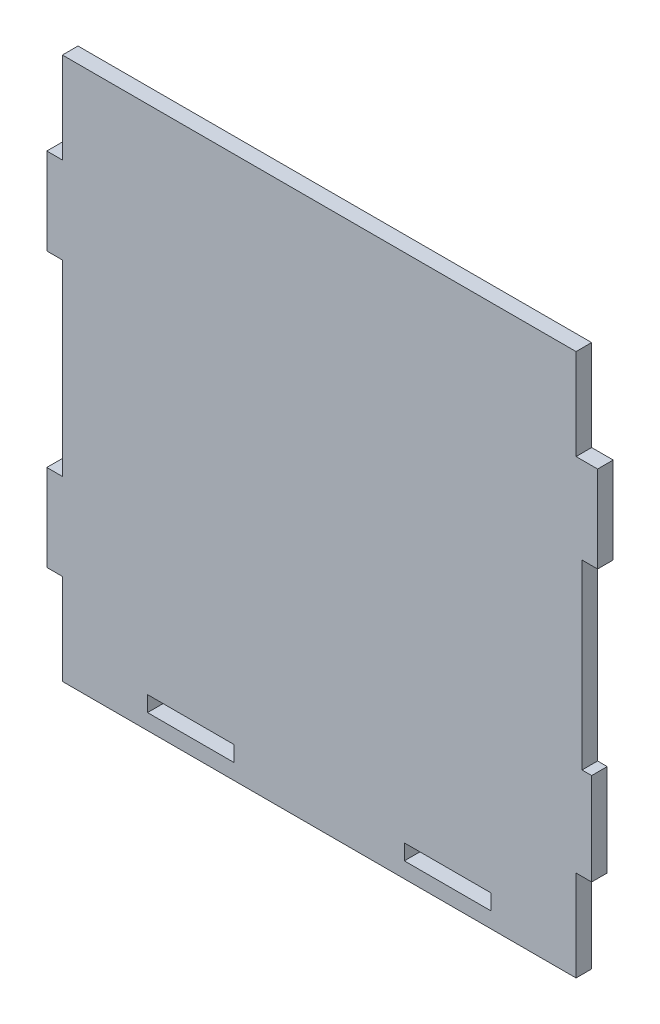
ISO-10303-21;
HEADER;
FILE_DESCRIPTION(('STEP AP214'),'2;1');
FILE_NAME('part.step','',(''),(''),'','','');
FILE_SCHEMA(('AUTOMOTIVE_DESIGN { 1 0 10303 214 1 1 1 1 }'));
ENDSEC;
DATA;
#1=APPLICATION_CONTEXT('core data for automotive mechanical design processes');
#2=APPLICATION_PROTOCOL_DEFINITION('international standard','automotive_design',2000,#1);
#3=PRODUCT_CONTEXT('',#1,'mechanical');
#4=PRODUCT('Part','Part','',(#3));
#5=PRODUCT_RELATED_PRODUCT_CATEGORY('part','',(#4));
#6=PRODUCT_DEFINITION_FORMATION('','',#4);
#7=PRODUCT_DEFINITION_CONTEXT('part definition',#1,'design');
#8=PRODUCT_DEFINITION('design','',#6,#7);
#9=PRODUCT_DEFINITION_SHAPE('','',#8);
#10=(LENGTH_UNIT() NAMED_UNIT(*) SI_UNIT(.MILLI.,.METRE.));
#11=(NAMED_UNIT(*) PLANE_ANGLE_UNIT() SI_UNIT($,.RADIAN.));
#12=(NAMED_UNIT(*) SI_UNIT($,.STERADIAN.) SOLID_ANGLE_UNIT());
#13=UNCERTAINTY_MEASURE_WITH_UNIT(LENGTH_MEASURE(1.E-05),#10,'distance_accuracy_value','');
#14=(GEOMETRIC_REPRESENTATION_CONTEXT(3) GLOBAL_UNCERTAINTY_ASSIGNED_CONTEXT((#13)) GLOBAL_UNIT_ASSIGNED_CONTEXT((#10,
#11,#12)) REPRESENTATION_CONTEXT('',''));
#15=CARTESIAN_POINT('',(0.,0.,0.));
#16=DIRECTION('',(0.,0.,1.));
#17=DIRECTION('',(1.,0.,0.));
#18=AXIS2_PLACEMENT_3D('',#15,#16,#17);
#19=CARTESIAN_POINT('',(0.,0.,18.));
#20=DIRECTION('',(0.,0.,1.));
#21=DIRECTION('',(1.,0.,0.));
#22=AXIS2_PLACEMENT_3D('',#19,#20,#21);
#23=PLANE('',#22);
#24=DIRECTION('',(1.,0.,0.));
#25=VECTOR('',#24,1.);
#26=CARTESIAN_POINT('',(-186.094182780378,-205.,18.));
#27=LINE('',#26,#25);
#28=CARTESIAN_POINT('',(-204.094182780379,-205.,18.));
#29=VERTEX_POINT('',#28);
#30=CARTESIAN_POINT('',(-186.094182780378,-205.,18.));
#31=VERTEX_POINT('',#30);
#32=EDGE_CURVE('E285',#29,#31,#27,.T.);
#33=ORIENTED_EDGE('',*,*,#32,.T.);
#34=DIRECTION('',(0.,1.,0.));
#35=VECTOR('',#34,1.);
#36=CARTESIAN_POINT('',(-186.094182780378,-105.,18.));
#37=LINE('',#36,#35);
#38=CARTESIAN_POINT('',(-186.094182780378,-105.,18.));
#39=VERTEX_POINT('',#38);
#40=EDGE_CURVE('E288',#31,#39,#37,.T.);
#41=ORIENTED_EDGE('',*,*,#40,.T.);
#42=DIRECTION('',(-1.,0.,0.));
#43=VECTOR('',#42,1.);
#44=CARTESIAN_POINT('',(-210.971781752116,-105.,18.));
#45=LINE('',#44,#43);
#46=CARTESIAN_POINT('',(-210.971781752116,-105.,18.));
#47=VERTEX_POINT('',#46);
#48=EDGE_CURVE('E291',#39,#47,#45,.T.);
#49=ORIENTED_EDGE('',*,*,#48,.T.);
#50=DIRECTION('',(0.,1.,0.));
#51=VECTOR('',#50,1.);
#52=CARTESIAN_POINT('',(-210.971781752116,0.,18.));
#53=LINE('',#52,#51);
#54=CARTESIAN_POINT('',(-210.971781752116,0.,18.));
#55=VERTEX_POINT('',#54);
#56=EDGE_CURVE('E293',#47,#55,#53,.T.);
#57=ORIENTED_EDGE('',*,*,#56,.T.);
#58=DIRECTION('',(-1.,0.,0.));
#59=VECTOR('',#58,1.);
#60=CARTESIAN_POINT('',(-210.971781752116,0.,18.));
#61=LINE('',#60,#59);
#62=CARTESIAN_POINT('',(-804.094182780378,0.,18.));
#63=VERTEX_POINT('',#62);
#64=EDGE_CURVE('E295',#55,#63,#61,.T.);
#65=ORIENTED_EDGE('',*,*,#64,.T.);
#66=DIRECTION('',(0.,-1.,0.));
#67=VECTOR('',#66,1.);
#68=CARTESIAN_POINT('',(-804.094182780378,0.,18.));
#69=LINE('',#68,#67);
#70=CARTESIAN_POINT('',(-804.094182780378,-105.,18.));
#71=VERTEX_POINT('',#70);
#72=EDGE_CURVE('E297',#63,#71,#69,.T.);
#73=ORIENTED_EDGE('',*,*,#72,.T.);
#74=DIRECTION('',(-1.,0.,0.));
#75=VECTOR('',#74,1.);
#76=CARTESIAN_POINT('',(-804.094182780378,-105.,18.));
#77=LINE('',#76,#75);
#78=CARTESIAN_POINT('',(-822.094182780378,-105.,18.));
#79=VERTEX_POINT('',#78);
#80=EDGE_CURVE('E299',#71,#79,#77,.T.);
#81=ORIENTED_EDGE('',*,*,#80,.T.);
#82=DIRECTION('',(0.,-1.,0.));
#83=VECTOR('',#82,1.);
#84=CARTESIAN_POINT('',(-822.094182780378,-105.,18.));
#85=LINE('',#84,#83);
#86=CARTESIAN_POINT('',(-822.094182780378,-205.,18.));
#87=VERTEX_POINT('',#86);
#88=EDGE_CURVE('E301',#79,#87,#85,.T.);
#89=ORIENTED_EDGE('',*,*,#88,.T.);
#90=DIRECTION('',(1.,0.,0.));
#91=VECTOR('',#90,1.);
#92=CARTESIAN_POINT('',(-822.094182780378,-205.,18.));
#93=LINE('',#92,#91);
#94=CARTESIAN_POINT('',(-804.094182780378,-205.,18.));
#95=VERTEX_POINT('',#94);
#96=EDGE_CURVE('E303',#87,#95,#93,.T.);
#97=ORIENTED_EDGE('',*,*,#96,.T.);
#98=DIRECTION('',(0.,-1.,0.));
#99=VECTOR('',#98,1.);
#100=CARTESIAN_POINT('',(-804.094182780378,-205.,18.));
#101=LINE('',#100,#99);
#102=CARTESIAN_POINT('',(-804.094182780378,-421.450726937701,18.));
#103=VERTEX_POINT('',#102);
#104=EDGE_CURVE('E305',#95,#103,#101,.T.);
#105=ORIENTED_EDGE('',*,*,#104,.T.);
#106=DIRECTION('',(-1.,0.,0.));
#107=VECTOR('',#106,1.);
#108=CARTESIAN_POINT('',(-822.094182780378,-421.450726937701,18.));
#109=LINE('',#108,#107);
#110=CARTESIAN_POINT('',(-822.094182780378,-421.450726937701,18.));
#111=VERTEX_POINT('',#110);
#112=EDGE_CURVE('E307',#103,#111,#109,.T.);
#113=ORIENTED_EDGE('',*,*,#112,.T.);
#114=DIRECTION('',(0.,-1.,0.));
#115=VECTOR('',#114,1.);
#116=CARTESIAN_POINT('',(-822.094182780378,-521.450726937702,18.));
#117=LINE('',#116,#115);
#118=CARTESIAN_POINT('',(-822.094182780378,-521.450726937702,18.));
#119=VERTEX_POINT('',#118);
#120=EDGE_CURVE('E309',#111,#119,#117,.T.);
#121=ORIENTED_EDGE('',*,*,#120,.T.);
#122=DIRECTION('',(1.,0.,0.));
#123=VECTOR('',#122,1.);
#124=CARTESIAN_POINT('',(-804.094182780378,-521.450726937702,18.));
#125=LINE('',#124,#123);
#126=CARTESIAN_POINT('',(-804.094182780378,-521.450726937702,18.));
#127=VERTEX_POINT('',#126);
#128=EDGE_CURVE('E311',#119,#127,#125,.T.);
#129=ORIENTED_EDGE('',*,*,#128,.T.);
#130=DIRECTION('',(0.,-1.,0.));
#131=VECTOR('',#130,1.);
#132=CARTESIAN_POINT('',(-804.094182780378,-626.450726937702,18.));
#133=LINE('',#132,#131);
#134=CARTESIAN_POINT('',(-804.094182780378,-626.450726937702,18.));
#135=VERTEX_POINT('',#134);
#136=EDGE_CURVE('E313',#127,#135,#133,.T.);
#137=ORIENTED_EDGE('',*,*,#136,.T.);
#138=DIRECTION('',(1.,0.,0.));
#139=VECTOR('',#138,1.);
#140=CARTESIAN_POINT('',(-210.971781752116,-626.450726937702,18.));
#141=LINE('',#140,#139);
#142=CARTESIAN_POINT('',(-210.971781752116,-626.450726937702,18.));
#143=VERTEX_POINT('',#142);
#144=EDGE_CURVE('E315',#135,#143,#141,.T.);
#145=ORIENTED_EDGE('',*,*,#144,.T.);
#146=DIRECTION('',(0.,1.,0.));
#147=VECTOR('',#146,1.);
#148=CARTESIAN_POINT('',(-210.971781752116,-626.450726937702,18.));
#149=LINE('',#148,#147);
#150=CARTESIAN_POINT('',(-210.971781752116,-521.450726937701,18.));
#151=VERTEX_POINT('',#150);
#152=EDGE_CURVE('E317',#143,#151,#149,.T.);
#153=ORIENTED_EDGE('',*,*,#152,.T.);
#154=DIRECTION('',(1.,0.,0.));
#155=VECTOR('',#154,1.);
#156=CARTESIAN_POINT('',(-210.971781752116,-521.450726937701,18.));
#157=LINE('',#156,#155);
#158=CARTESIAN_POINT('',(-192.971781752116,-521.450726937701,18.));
#159=VERTEX_POINT('',#158);
#160=EDGE_CURVE('E319',#151,#159,#157,.T.);
#161=ORIENTED_EDGE('',*,*,#160,.T.);
#162=DIRECTION('',(0.,1.,0.));
#163=VECTOR('',#162,1.);
#164=CARTESIAN_POINT('',(-192.971781752116,-521.450726937701,18.));
#165=LINE('',#164,#163);
#166=CARTESIAN_POINT('',(-192.971781752116,-415.,18.));
#167=VERTEX_POINT('',#166);
#168=EDGE_CURVE('E321',#159,#167,#165,.T.);
#169=ORIENTED_EDGE('',*,*,#168,.T.);
#170=DIRECTION('',(-1.,0.,0.));
#171=VECTOR('',#170,1.);
#172=CARTESIAN_POINT('',(-192.971781752116,-415.,18.));
#173=LINE('',#172,#171);
#174=CARTESIAN_POINT('',(-204.094182780379,-415.,18.));
#175=VERTEX_POINT('',#174);
#176=EDGE_CURVE('E323',#167,#175,#173,.T.);
#177=ORIENTED_EDGE('',*,*,#176,.T.);
#178=DIRECTION('',(0.,1.,0.));
#179=VECTOR('',#178,1.);
#180=CARTESIAN_POINT('',(-204.094182780379,-205.,18.));
#181=LINE('',#180,#179);
#182=EDGE_CURVE('E325',#175,#29,#181,.T.);
#183=ORIENTED_EDGE('',*,*,#182,.T.);
#184=EDGE_LOOP('',(#33,#41,#49,#57,#65,#73,#81,#89,#97,#105,#113,#121,#129,#137,#145,#153,#161,
#169,#177,#183));
#185=FACE_BOUND('',#184,.T.);
#186=DIRECTION('',(-1.,0.,0.));
#187=VECTOR('',#186,1.);
#188=CARTESIAN_POINT('',(-705.813582523313,-590.450726937701,18.));
#189=LINE('',#188,#187);
#190=CARTESIAN_POINT('',(-605.813582523313,-590.450726937701,18.));
#191=VERTEX_POINT('',#190);
#192=CARTESIAN_POINT('',(-705.813582523313,-590.450726937701,18.));
#193=VERTEX_POINT('',#192);
#194=EDGE_CURVE('E256',#191,#193,#189,.T.);
#195=ORIENTED_EDGE('',*,*,#194,.F.);
#196=DIRECTION('',(0.,1.,0.));
#197=VECTOR('',#196,1.);
#198=CARTESIAN_POINT('',(-605.813582523313,-590.450726937701,18.));
#199=LINE('',#198,#197);
#200=CARTESIAN_POINT('',(-605.813582523313,-608.450726937702,18.));
#201=VERTEX_POINT('',#200);
#202=EDGE_CURVE('E254',#201,#191,#199,.T.);
#203=ORIENTED_EDGE('',*,*,#202,.F.);
#204=DIRECTION('',(1.,0.,0.));
#205=VECTOR('',#204,1.);
#206=CARTESIAN_POINT('',(-705.813582523313,-608.450726937702,18.));
#207=LINE('',#206,#205);
#208=CARTESIAN_POINT('',(-705.813582523313,-608.450726937702,18.));
#209=VERTEX_POINT('',#208);
#210=EDGE_CURVE('E262',#209,#201,#207,.T.);
#211=ORIENTED_EDGE('',*,*,#210,.F.);
#212=DIRECTION('',(0.,-1.,0.));
#213=VECTOR('',#212,1.);
#214=CARTESIAN_POINT('',(-705.813582523313,-590.450726937701,18.));
#215=LINE('',#214,#213);
#216=EDGE_CURVE('E259',#193,#209,#215,.T.);
#217=ORIENTED_EDGE('',*,*,#216,.F.);
#218=EDGE_LOOP('',(#195,#203,#211,#217));
#219=FACE_BOUND('',#218,.T.);
#220=DIRECTION('',(0.,-1.,0.));
#221=VECTOR('',#220,1.);
#222=CARTESIAN_POINT('',(-409.252382009181,-590.450726937701,18.));
#223=LINE('',#222,#221);
#224=CARTESIAN_POINT('',(-409.252382009181,-590.450726937701,18.));
#225=VERTEX_POINT('',#224);
#226=CARTESIAN_POINT('',(-409.252382009181,-608.450726937702,18.));
#227=VERTEX_POINT('',#226);
#228=EDGE_CURVE('E226',#225,#227,#223,.T.);
#229=ORIENTED_EDGE('',*,*,#228,.F.);
#230=DIRECTION('',(-1.,0.,0.));
#231=VECTOR('',#230,1.);
#232=CARTESIAN_POINT('',(-309.252382009181,-590.450726937701,18.));
#233=LINE('',#232,#231);
#234=CARTESIAN_POINT('',(-309.252382009181,-590.450726937701,18.));
#235=VERTEX_POINT('',#234);
#236=EDGE_CURVE('E218',#235,#225,#233,.T.);
#237=ORIENTED_EDGE('',*,*,#236,.F.);
#238=DIRECTION('',(0.,1.,0.));
#239=VECTOR('',#238,1.);
#240=CARTESIAN_POINT('',(-309.252382009181,-590.450726937701,18.));
#241=LINE('',#240,#239);
#242=CARTESIAN_POINT('',(-309.252382009181,-608.450726937702,18.));
#243=VERTEX_POINT('',#242);
#244=EDGE_CURVE('E240',#243,#235,#241,.T.);
#245=ORIENTED_EDGE('',*,*,#244,.F.);
#246=DIRECTION('',(1.,0.,0.));
#247=VECTOR('',#246,1.);
#248=CARTESIAN_POINT('',(-309.252382009181,-608.450726937702,18.));
#249=LINE('',#248,#247);
#250=EDGE_CURVE('E238',#227,#243,#249,.T.);
#251=ORIENTED_EDGE('',*,*,#250,.F.);
#252=EDGE_LOOP('',(#229,#237,#245,#251));
#253=FACE_BOUND('',#252,.T.);
#254=ADVANCED_FACE('F33',(#185,#219,#253),#23,.T.);
#255=CARTESIAN_POINT('',(0.,0.,0.));
#256=DIRECTION('',(0.,0.,1.));
#257=DIRECTION('',(1.,0.,0.));
#258=AXIS2_PLACEMENT_3D('',#255,#256,#257);
#259=PLANE('',#258);
#260=DIRECTION('',(0.,1.,0.));
#261=VECTOR('',#260,1.);
#262=CARTESIAN_POINT('',(-605.813582523313,-590.450726937701,0.));
#263=LINE('',#262,#261);
#264=CARTESIAN_POINT('',(-605.813582523313,-608.450726937702,0.));
#265=VERTEX_POINT('',#264);
#266=CARTESIAN_POINT('',(-605.813582523313,-590.450726937701,0.));
#267=VERTEX_POINT('',#266);
#268=EDGE_CURVE('E234',#265,#267,#263,.T.);
#269=ORIENTED_EDGE('',*,*,#268,.T.);
#270=DIRECTION('',(-1.,0.,0.));
#271=VECTOR('',#270,1.);
#272=CARTESIAN_POINT('',(-705.813582523313,-590.450726937701,0.));
#273=LINE('',#272,#271);
#274=CARTESIAN_POINT('',(-705.813582523313,-590.450726937701,0.));
#275=VERTEX_POINT('',#274);
#276=EDGE_CURVE('E267',#267,#275,#273,.T.);
#277=ORIENTED_EDGE('',*,*,#276,.T.);
#278=DIRECTION('',(0.,-1.,0.));
#279=VECTOR('',#278,1.);
#280=CARTESIAN_POINT('',(-705.813582523313,-590.450726937701,0.));
#281=LINE('',#280,#279);
#282=CARTESIAN_POINT('',(-705.813582523313,-608.450726937702,0.));
#283=VERTEX_POINT('',#282);
#284=EDGE_CURVE('E270',#275,#283,#281,.T.);
#285=ORIENTED_EDGE('',*,*,#284,.T.);
#286=DIRECTION('',(1.,0.,0.));
#287=VECTOR('',#286,1.);
#288=CARTESIAN_POINT('',(-705.813582523313,-608.450726937702,0.));
#289=LINE('',#288,#287);
#290=EDGE_CURVE('E257',#283,#265,#289,.T.);
#291=ORIENTED_EDGE('',*,*,#290,.T.);
#292=EDGE_LOOP('',(#269,#277,#285,#291));
#293=FACE_BOUND('',#292,.T.);
#294=DIRECTION('',(1.,0.,0.));
#295=VECTOR('',#294,1.);
#296=CARTESIAN_POINT('',(-186.094182780378,-205.,0.));
#297=LINE('',#296,#295);
#298=CARTESIAN_POINT('',(-204.094182780379,-205.,0.));
#299=VERTEX_POINT('',#298);
#300=CARTESIAN_POINT('',(-186.094182780378,-205.,0.));
#301=VERTEX_POINT('',#300);
#302=EDGE_CURVE('E284',#299,#301,#297,.T.);
#303=ORIENTED_EDGE('',*,*,#302,.F.);
#304=DIRECTION('',(0.,1.,0.));
#305=VECTOR('',#304,1.);
#306=CARTESIAN_POINT('',(-204.094182780379,-205.,0.));
#307=LINE('',#306,#305);
#308=CARTESIAN_POINT('',(-204.094182780379,-415.,0.));
#309=VERTEX_POINT('',#308);
#310=EDGE_CURVE('E289',#309,#299,#307,.T.);
#311=ORIENTED_EDGE('',*,*,#310,.F.);
#312=DIRECTION('',(-1.,0.,0.));
#313=VECTOR('',#312,1.);
#314=CARTESIAN_POINT('',(-192.971781752116,-415.,0.));
#315=LINE('',#314,#313);
#316=CARTESIAN_POINT('',(-192.971781752116,-415.,0.));
#317=VERTEX_POINT('',#316);
#318=EDGE_CURVE('E364',#317,#309,#315,.T.);
#319=ORIENTED_EDGE('',*,*,#318,.F.);
#320=DIRECTION('',(0.,1.,0.));
#321=VECTOR('',#320,1.);
#322=CARTESIAN_POINT('',(-192.971781752116,-521.450726937701,0.));
#323=LINE('',#322,#321);
#324=CARTESIAN_POINT('',(-192.971781752116,-521.450726937701,0.));
#325=VERTEX_POINT('',#324);
#326=EDGE_CURVE('E362',#325,#317,#323,.T.);
#327=ORIENTED_EDGE('',*,*,#326,.F.);
#328=DIRECTION('',(1.,0.,0.));
#329=VECTOR('',#328,1.);
#330=CARTESIAN_POINT('',(-210.971781752116,-521.450726937701,0.));
#331=LINE('',#330,#329);
#332=CARTESIAN_POINT('',(-210.971781752116,-521.450726937701,0.));
#333=VERTEX_POINT('',#332);
#334=EDGE_CURVE('E360',#333,#325,#331,.T.);
#335=ORIENTED_EDGE('',*,*,#334,.F.);
#336=DIRECTION('',(0.,1.,0.));
#337=VECTOR('',#336,1.);
#338=CARTESIAN_POINT('',(-210.971781752116,-626.450726937702,0.));
#339=LINE('',#338,#337);
#340=CARTESIAN_POINT('',(-210.971781752116,-626.450726937702,0.));
#341=VERTEX_POINT('',#340);
#342=EDGE_CURVE('E358',#341,#333,#339,.T.);
#343=ORIENTED_EDGE('',*,*,#342,.F.);
#344=DIRECTION('',(1.,0.,0.));
#345=VECTOR('',#344,1.);
#346=CARTESIAN_POINT('',(-210.971781752116,-626.450726937702,0.));
#347=LINE('',#346,#345);
#348=CARTESIAN_POINT('',(-804.094182780378,-626.450726937702,0.));
#349=VERTEX_POINT('',#348);
#350=EDGE_CURVE('E356',#349,#341,#347,.T.);
#351=ORIENTED_EDGE('',*,*,#350,.F.);
#352=DIRECTION('',(0.,-1.,0.));
#353=VECTOR('',#352,1.);
#354=CARTESIAN_POINT('',(-804.094182780378,-626.450726937702,0.));
#355=LINE('',#354,#353);
#356=CARTESIAN_POINT('',(-804.094182780378,-521.450726937702,0.));
#357=VERTEX_POINT('',#356);
#358=EDGE_CURVE('E354',#357,#349,#355,.T.);
#359=ORIENTED_EDGE('',*,*,#358,.F.);
#360=DIRECTION('',(1.,0.,0.));
#361=VECTOR('',#360,1.);
#362=CARTESIAN_POINT('',(-804.094182780378,-521.450726937702,0.));
#363=LINE('',#362,#361);
#364=CARTESIAN_POINT('',(-822.094182780378,-521.450726937702,0.));
#365=VERTEX_POINT('',#364);
#366=EDGE_CURVE('E352',#365,#357,#363,.T.);
#367=ORIENTED_EDGE('',*,*,#366,.F.);
#368=DIRECTION('',(0.,-1.,0.));
#369=VECTOR('',#368,1.);
#370=CARTESIAN_POINT('',(-822.094182780378,-521.450726937702,0.));
#371=LINE('',#370,#369);
#372=CARTESIAN_POINT('',(-822.094182780378,-421.450726937701,0.));
#373=VERTEX_POINT('',#372);
#374=EDGE_CURVE('E350',#373,#365,#371,.T.);
#375=ORIENTED_EDGE('',*,*,#374,.F.);
#376=DIRECTION('',(-1.,0.,0.));
#377=VECTOR('',#376,1.);
#378=CARTESIAN_POINT('',(-822.094182780378,-421.450726937701,0.));
#379=LINE('',#378,#377);
#380=CARTESIAN_POINT('',(-804.094182780378,-421.450726937701,0.));
#381=VERTEX_POINT('',#380);
#382=EDGE_CURVE('E348',#381,#373,#379,.T.);
#383=ORIENTED_EDGE('',*,*,#382,.F.);
#384=DIRECTION('',(0.,-1.,0.));
#385=VECTOR('',#384,1.);
#386=CARTESIAN_POINT('',(-804.094182780378,-205.,0.));
#387=LINE('',#386,#385);
#388=CARTESIAN_POINT('',(-804.094182780378,-205.,0.));
#389=VERTEX_POINT('',#388);
#390=EDGE_CURVE('E346',#389,#381,#387,.T.);
#391=ORIENTED_EDGE('',*,*,#390,.F.);
#392=DIRECTION('',(1.,0.,0.));
#393=VECTOR('',#392,1.);
#394=CARTESIAN_POINT('',(-822.094182780378,-205.,0.));
#395=LINE('',#394,#393);
#396=CARTESIAN_POINT('',(-822.094182780378,-205.,0.));
#397=VERTEX_POINT('',#396);
#398=EDGE_CURVE('E344',#397,#389,#395,.T.);
#399=ORIENTED_EDGE('',*,*,#398,.F.);
#400=DIRECTION('',(0.,-1.,0.));
#401=VECTOR('',#400,1.);
#402=CARTESIAN_POINT('',(-822.094182780378,-105.,0.));
#403=LINE('',#402,#401);
#404=CARTESIAN_POINT('',(-822.094182780378,-105.,0.));
#405=VERTEX_POINT('',#404);
#406=EDGE_CURVE('E342',#405,#397,#403,.T.);
#407=ORIENTED_EDGE('',*,*,#406,.F.);
#408=DIRECTION('',(-1.,0.,0.));
#409=VECTOR('',#408,1.);
#410=CARTESIAN_POINT('',(-804.094182780378,-105.,0.));
#411=LINE('',#410,#409);
#412=CARTESIAN_POINT('',(-804.094182780378,-105.,0.));
#413=VERTEX_POINT('',#412);
#414=EDGE_CURVE('E340',#413,#405,#411,.T.);
#415=ORIENTED_EDGE('',*,*,#414,.F.);
#416=DIRECTION('',(0.,-1.,0.));
#417=VECTOR('',#416,1.);
#418=CARTESIAN_POINT('',(-804.094182780378,0.,0.));
#419=LINE('',#418,#417);
#420=CARTESIAN_POINT('',(-804.094182780378,0.,0.));
#421=VERTEX_POINT('',#420);
#422=EDGE_CURVE('E338',#421,#413,#419,.T.);
#423=ORIENTED_EDGE('',*,*,#422,.F.);
#424=DIRECTION('',(-1.,0.,0.));
#425=VECTOR('',#424,1.);
#426=CARTESIAN_POINT('',(-210.971781752116,0.,0.));
#427=LINE('',#426,#425);
#428=CARTESIAN_POINT('',(-210.971781752116,0.,0.));
#429=VERTEX_POINT('',#428);
#430=EDGE_CURVE('E336',#429,#421,#427,.T.);
#431=ORIENTED_EDGE('',*,*,#430,.F.);
#432=DIRECTION('',(0.,1.,0.));
#433=VECTOR('',#432,1.);
#434=CARTESIAN_POINT('',(-210.971781752116,0.,0.));
#435=LINE('',#434,#433);
#436=CARTESIAN_POINT('',(-210.971781752116,-105.,0.));
#437=VERTEX_POINT('',#436);
#438=EDGE_CURVE('E334',#437,#429,#435,.T.);
#439=ORIENTED_EDGE('',*,*,#438,.F.);
#440=DIRECTION('',(-1.,0.,0.));
#441=VECTOR('',#440,1.);
#442=CARTESIAN_POINT('',(-210.971781752116,-105.,0.));
#443=LINE('',#442,#441);
#444=CARTESIAN_POINT('',(-186.094182780378,-105.,0.));
#445=VERTEX_POINT('',#444);
#446=EDGE_CURVE('E332',#445,#437,#443,.T.);
#447=ORIENTED_EDGE('',*,*,#446,.F.);
#448=DIRECTION('',(0.,1.,0.));
#449=VECTOR('',#448,1.);
#450=CARTESIAN_POINT('',(-186.094182780378,-105.,0.));
#451=LINE('',#450,#449);
#452=EDGE_CURVE('E330',#301,#445,#451,.T.);
#453=ORIENTED_EDGE('',*,*,#452,.F.);
#454=EDGE_LOOP('',(#303,#311,#319,#327,#335,#343,#351,#359,#367,#375,#383,#391,#399,#407,#415,
#423,#431,#439,#447,#453));
#455=FACE_BOUND('',#454,.T.);
#456=DIRECTION('',(-1.,0.,0.));
#457=VECTOR('',#456,1.);
#458=CARTESIAN_POINT('',(-309.252382009181,-590.450726937701,0.));
#459=LINE('',#458,#457);
#460=CARTESIAN_POINT('',(-309.252382009181,-590.450726937701,0.));
#461=VERTEX_POINT('',#460);
#462=CARTESIAN_POINT('',(-409.252382009181,-590.450726937701,0.));
#463=VERTEX_POINT('',#462);
#464=EDGE_CURVE('E56',#461,#463,#459,.T.);
#465=ORIENTED_EDGE('',*,*,#464,.T.);
#466=DIRECTION('',(0.,-1.,0.));
#467=VECTOR('',#466,1.);
#468=CARTESIAN_POINT('',(-409.252382009181,-590.450726937701,0.));
#469=LINE('',#468,#467);
#470=CARTESIAN_POINT('',(-409.252382009181,-608.450726937702,0.));
#471=VERTEX_POINT('',#470);
#472=EDGE_CURVE('E233',#463,#471,#469,.T.);
#473=ORIENTED_EDGE('',*,*,#472,.T.);
#474=DIRECTION('',(1.,0.,0.));
#475=VECTOR('',#474,1.);
#476=CARTESIAN_POINT('',(-309.252382009181,-608.450726937702,0.));
#477=LINE('',#476,#475);
#478=CARTESIAN_POINT('',(-309.252382009181,-608.450726937702,0.));
#479=VERTEX_POINT('',#478);
#480=EDGE_CURVE('E246',#471,#479,#477,.T.);
#481=ORIENTED_EDGE('',*,*,#480,.T.);
#482=DIRECTION('',(0.,1.,0.));
#483=VECTOR('',#482,1.);
#484=CARTESIAN_POINT('',(-309.252382009181,-590.450726937701,0.));
#485=LINE('',#484,#483);
#486=EDGE_CURVE('E227',#479,#461,#485,.T.);
#487=ORIENTED_EDGE('',*,*,#486,.T.);
#488=EDGE_LOOP('',(#465,#473,#481,#487));
#489=FACE_BOUND('',#488,.T.);
#490=ADVANCED_FACE('F430',(#293,#455,#489),#259,.F.);
#491=CARTESIAN_POINT('',(-186.094182780378,-205.,18.));
#492=DIRECTION('',(0.,1.,0.));
#493=DIRECTION('',(-1.,0.,0.));
#494=AXIS2_PLACEMENT_3D('',#491,#492,#493);
#495=PLANE('',#494);
#496=ORIENTED_EDGE('',*,*,#302,.T.);
#497=DIRECTION('',(0.,0.,-1.));
#498=VECTOR('',#497,1.);
#499=CARTESIAN_POINT('',(-186.094182780378,-205.,18.));
#500=LINE('',#499,#498);
#501=EDGE_CURVE('E11',#31,#301,#500,.T.);
#502=ORIENTED_EDGE('',*,*,#501,.F.);
#503=ORIENTED_EDGE('',*,*,#32,.F.);
#504=DIRECTION('',(0.,0.,-1.));
#505=VECTOR('',#504,1.);
#506=CARTESIAN_POINT('',(-204.094182780379,-205.,18.));
#507=LINE('',#506,#505);
#508=EDGE_CURVE('E327',#29,#299,#507,.T.);
#509=ORIENTED_EDGE('',*,*,#508,.T.);
#510=EDGE_LOOP('',(#496,#502,#503,#509));
#511=FACE_BOUND('',#510,.T.);
#512=ADVANCED_FACE('F35',(#511),#495,.F.);
#513=CARTESIAN_POINT('',(-186.094182780378,-105.,18.));
#514=DIRECTION('',(-1.,0.,0.));
#515=DIRECTION('',(0.,0.,1.));
#516=AXIS2_PLACEMENT_3D('',#513,#514,#515);
#517=PLANE('',#516);
#518=ORIENTED_EDGE('',*,*,#452,.T.);
#519=DIRECTION('',(0.,0.,-1.));
#520=VECTOR('',#519,1.);
#521=CARTESIAN_POINT('',(-186.094182780378,-105.,18.));
#522=LINE('',#521,#520);
#523=EDGE_CURVE('E41',#39,#445,#522,.T.);
#524=ORIENTED_EDGE('',*,*,#523,.F.);
#525=ORIENTED_EDGE('',*,*,#40,.F.);
#526=ORIENTED_EDGE('',*,*,#501,.T.);
#527=EDGE_LOOP('',(#518,#524,#525,#526));
#528=FACE_BOUND('',#527,.T.);
#529=ADVANCED_FACE('F448',(#528),#517,.F.);
#530=CARTESIAN_POINT('',(-210.971781752116,-105.,18.));
#531=DIRECTION('',(0.,-1.,0.));
#532=DIRECTION('',(1.,0.,0.));
#533=AXIS2_PLACEMENT_3D('',#530,#531,#532);
#534=PLANE('',#533);
#535=ORIENTED_EDGE('',*,*,#446,.T.);
#536=DIRECTION('',(0.,0.,-1.));
#537=VECTOR('',#536,1.);
#538=CARTESIAN_POINT('',(-210.971781752116,-105.,18.));
#539=LINE('',#538,#537);
#540=EDGE_CURVE('E417',#47,#437,#539,.T.);
#541=ORIENTED_EDGE('',*,*,#540,.F.);
#542=ORIENTED_EDGE('',*,*,#48,.F.);
#543=ORIENTED_EDGE('',*,*,#523,.T.);
#544=EDGE_LOOP('',(#535,#541,#542,#543));
#545=FACE_BOUND('',#544,.T.);
#546=ADVANCED_FACE('F424',(#545),#534,.F.);
#547=CARTESIAN_POINT('',(-210.971781752116,0.,18.));
#548=DIRECTION('',(-1.,0.,0.));
#549=DIRECTION('',(0.,0.,1.));
#550=AXIS2_PLACEMENT_3D('',#547,#548,#549);
#551=PLANE('',#550);
#552=ORIENTED_EDGE('',*,*,#438,.T.);
#553=DIRECTION('',(0.,0.,-1.));
#554=VECTOR('',#553,1.);
#555=CARTESIAN_POINT('',(-210.971781752116,0.,18.));
#556=LINE('',#555,#554);
#557=EDGE_CURVE('E414',#55,#429,#556,.T.);
#558=ORIENTED_EDGE('',*,*,#557,.F.);
#559=ORIENTED_EDGE('',*,*,#56,.F.);
#560=ORIENTED_EDGE('',*,*,#540,.T.);
#561=EDGE_LOOP('',(#552,#558,#559,#560));
#562=FACE_BOUND('',#561,.T.);
#563=ADVANCED_FACE('F436',(#562),#551,.F.);
#564=CARTESIAN_POINT('',(-210.971781752116,0.,18.));
#565=DIRECTION('',(0.,-1.,0.));
#566=DIRECTION('',(1.,0.,0.));
#567=AXIS2_PLACEMENT_3D('',#564,#565,#566);
#568=PLANE('',#567);
#569=ORIENTED_EDGE('',*,*,#430,.T.);
#570=DIRECTION('',(0.,0.,-1.));
#571=VECTOR('',#570,1.);
#572=CARTESIAN_POINT('',(-804.094182780378,0.,18.));
#573=LINE('',#572,#571);
#574=EDGE_CURVE('E411',#63,#421,#573,.T.);
#575=ORIENTED_EDGE('',*,*,#574,.F.);
#576=ORIENTED_EDGE('',*,*,#64,.F.);
#577=ORIENTED_EDGE('',*,*,#557,.T.);
#578=EDGE_LOOP('',(#569,#575,#576,#577));
#579=FACE_BOUND('',#578,.T.);
#580=ADVANCED_FACE('F440',(#579),#568,.F.);
#581=CARTESIAN_POINT('',(-804.094182780378,0.,18.));
#582=DIRECTION('',(1.,0.,0.));
#583=DIRECTION('',(0.,0.,-1.));
#584=AXIS2_PLACEMENT_3D('',#581,#582,#583);
#585=PLANE('',#584);
#586=ORIENTED_EDGE('',*,*,#422,.T.);
#587=DIRECTION('',(0.,0.,-1.));
#588=VECTOR('',#587,1.);
#589=CARTESIAN_POINT('',(-804.094182780378,-105.,18.));
#590=LINE('',#589,#588);
#591=EDGE_CURVE('E408',#71,#413,#590,.T.);
#592=ORIENTED_EDGE('',*,*,#591,.F.);
#593=ORIENTED_EDGE('',*,*,#72,.F.);
#594=ORIENTED_EDGE('',*,*,#574,.T.);
#595=EDGE_LOOP('',(#586,#592,#593,#594));
#596=FACE_BOUND('',#595,.T.);
#597=ADVANCED_FACE('F521',(#596),#585,.F.);
#598=CARTESIAN_POINT('',(-804.094182780378,-105.,18.));
#599=DIRECTION('',(0.,-1.,0.));
#600=DIRECTION('',(1.,0.,0.));
#601=AXIS2_PLACEMENT_3D('',#598,#599,#600);
#602=PLANE('',#601);
#603=ORIENTED_EDGE('',*,*,#414,.T.);
#604=DIRECTION('',(0.,0.,-1.));
#605=VECTOR('',#604,1.);
#606=CARTESIAN_POINT('',(-822.094182780378,-105.,18.));
#607=LINE('',#606,#605);
#608=EDGE_CURVE('E405',#79,#405,#607,.T.);
#609=ORIENTED_EDGE('',*,*,#608,.F.);
#610=ORIENTED_EDGE('',*,*,#80,.F.);
#611=ORIENTED_EDGE('',*,*,#591,.T.);
#612=EDGE_LOOP('',(#603,#609,#610,#611));
#613=FACE_BOUND('',#612,.T.);
#614=ADVANCED_FACE('F519',(#613),#602,.F.);
#615=CARTESIAN_POINT('',(-822.094182780378,-105.,18.));
#616=DIRECTION('',(1.,0.,0.));
#617=DIRECTION('',(0.,0.,-1.));
#618=AXIS2_PLACEMENT_3D('',#615,#616,#617);
#619=PLANE('',#618);
#620=ORIENTED_EDGE('',*,*,#406,.T.);
#621=DIRECTION('',(0.,0.,-1.));
#622=VECTOR('',#621,1.);
#623=CARTESIAN_POINT('',(-822.094182780378,-205.,18.));
#624=LINE('',#623,#622);
#625=EDGE_CURVE('E402',#87,#397,#624,.T.);
#626=ORIENTED_EDGE('',*,*,#625,.F.);
#627=ORIENTED_EDGE('',*,*,#88,.F.);
#628=ORIENTED_EDGE('',*,*,#608,.T.);
#629=EDGE_LOOP('',(#620,#626,#627,#628));
#630=FACE_BOUND('',#629,.T.);
#631=ADVANCED_FACE('F514',(#630),#619,.F.);
#632=CARTESIAN_POINT('',(-822.094182780378,-205.,18.));
#633=DIRECTION('',(0.,1.,0.));
#634=DIRECTION('',(-1.,0.,0.));
#635=AXIS2_PLACEMENT_3D('',#632,#633,#634);
#636=PLANE('',#635);
#637=ORIENTED_EDGE('',*,*,#398,.T.);
#638=DIRECTION('',(0.,0.,-1.));
#639=VECTOR('',#638,1.);
#640=CARTESIAN_POINT('',(-804.094182780378,-205.,18.));
#641=LINE('',#640,#639);
#642=EDGE_CURVE('E399',#95,#389,#641,.T.);
#643=ORIENTED_EDGE('',*,*,#642,.F.);
#644=ORIENTED_EDGE('',*,*,#96,.F.);
#645=ORIENTED_EDGE('',*,*,#625,.T.);
#646=EDGE_LOOP('',(#637,#643,#644,#645));
#647=FACE_BOUND('',#646,.T.);
#648=ADVANCED_FACE('F509',(#647),#636,.F.);
#649=CARTESIAN_POINT('',(-804.094182780378,-205.,18.));
#650=DIRECTION('',(1.,0.,0.));
#651=DIRECTION('',(0.,0.,-1.));
#652=AXIS2_PLACEMENT_3D('',#649,#650,#651);
#653=PLANE('',#652);
#654=ORIENTED_EDGE('',*,*,#390,.T.);
#655=DIRECTION('',(0.,0.,-1.));
#656=VECTOR('',#655,1.);
#657=CARTESIAN_POINT('',(-804.094182780378,-421.450726937701,18.));
#658=LINE('',#657,#656);
#659=EDGE_CURVE('E396',#103,#381,#658,.T.);
#660=ORIENTED_EDGE('',*,*,#659,.F.);
#661=ORIENTED_EDGE('',*,*,#104,.F.);
#662=ORIENTED_EDGE('',*,*,#642,.T.);
#663=EDGE_LOOP('',(#654,#660,#661,#662));
#664=FACE_BOUND('',#663,.T.);
#665=ADVANCED_FACE('F505',(#664),#653,.F.);
#666=CARTESIAN_POINT('',(-822.094182780378,-421.450726937701,18.));
#667=DIRECTION('',(0.,-1.,0.));
#668=DIRECTION('',(0.,0.,-1.));
#669=AXIS2_PLACEMENT_3D('',#666,#667,#668);
#670=PLANE('',#669);
#671=ORIENTED_EDGE('',*,*,#382,.T.);
#672=DIRECTION('',(0.,0.,-1.));
#673=VECTOR('',#672,1.);
#674=CARTESIAN_POINT('',(-822.094182780378,-421.450726937701,18.));
#675=LINE('',#674,#673);
#676=EDGE_CURVE('E393',#111,#373,#675,.T.);
#677=ORIENTED_EDGE('',*,*,#676,.F.);
#678=ORIENTED_EDGE('',*,*,#112,.F.);
#679=ORIENTED_EDGE('',*,*,#659,.T.);
#680=EDGE_LOOP('',(#671,#677,#678,#679));
#681=FACE_BOUND('',#680,.T.);
#682=ADVANCED_FACE('F500',(#681),#670,.F.);
#683=CARTESIAN_POINT('',(-822.094182780378,-521.450726937702,18.));
#684=DIRECTION('',(1.,0.,0.));
#685=DIRECTION('',(0.,0.,-1.));
#686=AXIS2_PLACEMENT_3D('',#683,#684,#685);
#687=PLANE('',#686);
#688=ORIENTED_EDGE('',*,*,#374,.T.);
#689=DIRECTION('',(0.,0.,-1.));
#690=VECTOR('',#689,1.);
#691=CARTESIAN_POINT('',(-822.094182780378,-521.450726937702,18.));
#692=LINE('',#691,#690);
#693=EDGE_CURVE('E390',#119,#365,#692,.T.);
#694=ORIENTED_EDGE('',*,*,#693,.F.);
#695=ORIENTED_EDGE('',*,*,#120,.F.);
#696=ORIENTED_EDGE('',*,*,#676,.T.);
#697=EDGE_LOOP('',(#688,#694,#695,#696));
#698=FACE_BOUND('',#697,.T.);
#699=ADVANCED_FACE('F494',(#698),#687,.F.);
#700=CARTESIAN_POINT('',(-804.094182780378,-521.450726937702,18.));
#701=DIRECTION('',(0.,1.,0.));
#702=DIRECTION('',(0.,0.,1.));
#703=AXIS2_PLACEMENT_3D('',#700,#701,#702);
#704=PLANE('',#703);
#705=ORIENTED_EDGE('',*,*,#366,.T.);
#706=DIRECTION('',(0.,0.,-1.));
#707=VECTOR('',#706,1.);
#708=CARTESIAN_POINT('',(-804.094182780378,-521.450726937702,18.));
#709=LINE('',#708,#707);
#710=EDGE_CURVE('E387',#127,#357,#709,.T.);
#711=ORIENTED_EDGE('',*,*,#710,.F.);
#712=ORIENTED_EDGE('',*,*,#128,.F.);
#713=ORIENTED_EDGE('',*,*,#693,.T.);
#714=EDGE_LOOP('',(#705,#711,#712,#713));
#715=FACE_BOUND('',#714,.T.);
#716=ADVANCED_FACE('F490',(#715),#704,.F.);
#717=CARTESIAN_POINT('',(-804.094182780378,-626.450726937702,18.));
#718=DIRECTION('',(1.,0.,0.));
#719=DIRECTION('',(0.,1.,0.));
#720=AXIS2_PLACEMENT_3D('',#717,#718,#719);
#721=PLANE('',#720);
#722=ORIENTED_EDGE('',*,*,#358,.T.);
#723=DIRECTION('',(0.,0.,-1.));
#724=VECTOR('',#723,1.);
#725=CARTESIAN_POINT('',(-804.094182780378,-626.450726937702,18.));
#726=LINE('',#725,#724);
#727=EDGE_CURVE('E384',#135,#349,#726,.T.);
#728=ORIENTED_EDGE('',*,*,#727,.F.);
#729=ORIENTED_EDGE('',*,*,#136,.F.);
#730=ORIENTED_EDGE('',*,*,#710,.T.);
#731=EDGE_LOOP('',(#722,#728,#729,#730));
#732=FACE_BOUND('',#731,.T.);
#733=ADVANCED_FACE('F485',(#732),#721,.F.);
#734=CARTESIAN_POINT('',(-210.971781752116,-626.450726937702,18.));
#735=DIRECTION('',(0.,1.,0.));
#736=DIRECTION('',(-1.,0.,0.));
#737=AXIS2_PLACEMENT_3D('',#734,#735,#736);
#738=PLANE('',#737);
#739=ORIENTED_EDGE('',*,*,#350,.T.);
#740=DIRECTION('',(0.,0.,-1.));
#741=VECTOR('',#740,1.);
#742=CARTESIAN_POINT('',(-210.971781752116,-626.450726937702,18.));
#743=LINE('',#742,#741);
#744=EDGE_CURVE('E381',#143,#341,#743,.T.);
#745=ORIENTED_EDGE('',*,*,#744,.F.);
#746=ORIENTED_EDGE('',*,*,#144,.F.);
#747=ORIENTED_EDGE('',*,*,#727,.T.);
#748=EDGE_LOOP('',(#739,#745,#746,#747));
#749=FACE_BOUND('',#748,.T.);
#750=ADVANCED_FACE('F479',(#749),#738,.F.);
#751=CARTESIAN_POINT('',(-210.971781752116,-626.450726937702,18.));
#752=DIRECTION('',(-1.,0.,0.));
#753=DIRECTION('',(0.,0.,1.));
#754=AXIS2_PLACEMENT_3D('',#751,#752,#753);
#755=PLANE('',#754);
#756=ORIENTED_EDGE('',*,*,#342,.T.);
#757=DIRECTION('',(0.,0.,-1.));
#758=VECTOR('',#757,1.);
#759=CARTESIAN_POINT('',(-210.971781752116,-521.450726937701,18.));
#760=LINE('',#759,#758);
#761=EDGE_CURVE('E378',#151,#333,#760,.T.);
#762=ORIENTED_EDGE('',*,*,#761,.F.);
#763=ORIENTED_EDGE('',*,*,#152,.F.);
#764=ORIENTED_EDGE('',*,*,#744,.T.);
#765=EDGE_LOOP('',(#756,#762,#763,#764));
#766=FACE_BOUND('',#765,.T.);
#767=ADVANCED_FACE('F475',(#766),#755,.F.);
#768=CARTESIAN_POINT('',(-210.971781752116,-521.450726937701,18.));
#769=DIRECTION('',(0.,1.,0.));
#770=DIRECTION('',(0.,0.,1.));
#771=AXIS2_PLACEMENT_3D('',#768,#769,#770);
#772=PLANE('',#771);
#773=ORIENTED_EDGE('',*,*,#334,.T.);
#774=DIRECTION('',(0.,0.,-1.));
#775=VECTOR('',#774,1.);
#776=CARTESIAN_POINT('',(-192.971781752116,-521.450726937701,18.));
#777=LINE('',#776,#775);
#778=EDGE_CURVE('E375',#159,#325,#777,.T.);
#779=ORIENTED_EDGE('',*,*,#778,.F.);
#780=ORIENTED_EDGE('',*,*,#160,.F.);
#781=ORIENTED_EDGE('',*,*,#761,.T.);
#782=EDGE_LOOP('',(#773,#779,#780,#781));
#783=FACE_BOUND('',#782,.T.);
#784=ADVANCED_FACE('F470',(#783),#772,.F.);
#785=CARTESIAN_POINT('',(-192.971781752116,-521.450726937701,18.));
#786=DIRECTION('',(-1.,0.,0.));
#787=DIRECTION('',(0.,0.,1.));
#788=AXIS2_PLACEMENT_3D('',#785,#786,#787);
#789=PLANE('',#788);
#790=ORIENTED_EDGE('',*,*,#326,.T.);
#791=DIRECTION('',(0.,0.,-1.));
#792=VECTOR('',#791,1.);
#793=CARTESIAN_POINT('',(-192.971781752116,-415.,18.));
#794=LINE('',#793,#792);
#795=EDGE_CURVE('E372',#167,#317,#794,.T.);
#796=ORIENTED_EDGE('',*,*,#795,.F.);
#797=ORIENTED_EDGE('',*,*,#168,.F.);
#798=ORIENTED_EDGE('',*,*,#778,.T.);
#799=EDGE_LOOP('',(#790,#796,#797,#798));
#800=FACE_BOUND('',#799,.T.);
#801=ADVANCED_FACE('F464',(#800),#789,.F.);
#802=CARTESIAN_POINT('',(-192.971781752116,-415.,18.));
#803=DIRECTION('',(0.,-1.,0.));
#804=DIRECTION('',(0.,0.,-1.));
#805=AXIS2_PLACEMENT_3D('',#802,#803,#804);
#806=PLANE('',#805);
#807=ORIENTED_EDGE('',*,*,#318,.T.);
#808=DIRECTION('',(0.,0.,-1.));
#809=VECTOR('',#808,1.);
#810=CARTESIAN_POINT('',(-204.094182780379,-415.,18.));
#811=LINE('',#810,#809);
#812=EDGE_CURVE('E369',#175,#309,#811,.T.);
#813=ORIENTED_EDGE('',*,*,#812,.F.);
#814=ORIENTED_EDGE('',*,*,#176,.F.);
#815=ORIENTED_EDGE('',*,*,#795,.T.);
#816=EDGE_LOOP('',(#807,#813,#814,#815));
#817=FACE_BOUND('',#816,.T.);
#818=ADVANCED_FACE('F460',(#817),#806,.F.);
#819=CARTESIAN_POINT('',(-204.094182780379,-205.,18.));
#820=DIRECTION('',(-1.,0.,0.));
#821=DIRECTION('',(0.,0.,1.));
#822=AXIS2_PLACEMENT_3D('',#819,#820,#821);
#823=PLANE('',#822);
#824=ORIENTED_EDGE('',*,*,#310,.T.);
#825=ORIENTED_EDGE('',*,*,#508,.F.);
#826=ORIENTED_EDGE('',*,*,#182,.F.);
#827=ORIENTED_EDGE('',*,*,#812,.T.);
#828=EDGE_LOOP('',(#824,#825,#826,#827));
#829=FACE_BOUND('',#828,.T.);
#830=ADVANCED_FACE('F455',(#829),#823,.F.);
#831=CARTESIAN_POINT('',(-605.813582523313,-590.450726937701,18.));
#832=DIRECTION('',(-1.,0.,0.));
#833=DIRECTION('',(0.,0.,1.));
#834=AXIS2_PLACEMENT_3D('',#831,#832,#833);
#835=PLANE('',#834);
#836=ORIENTED_EDGE('',*,*,#268,.F.);
#837=DIRECTION('',(0.,0.,-1.));
#838=VECTOR('',#837,1.);
#839=CARTESIAN_POINT('',(-605.813582523313,-608.450726937702,18.));
#840=LINE('',#839,#838);
#841=EDGE_CURVE('E264',#201,#265,#840,.T.);
#842=ORIENTED_EDGE('',*,*,#841,.F.);
#843=ORIENTED_EDGE('',*,*,#202,.T.);
#844=DIRECTION('',(0.,0.,-1.));
#845=VECTOR('',#844,1.);
#846=CARTESIAN_POINT('',(-605.813582523313,-590.450726937701,18.));
#847=LINE('',#846,#845);
#848=EDGE_CURVE('E281',#191,#267,#847,.T.);
#849=ORIENTED_EDGE('',*,*,#848,.T.);
#850=EDGE_LOOP('',(#836,#842,#843,#849));
#851=FACE_BOUND('',#850,.T.);
#852=ADVANCED_FACE('F538',(#851),#835,.T.);
#853=CARTESIAN_POINT('',(-705.813582523313,-590.450726937701,18.));
#854=DIRECTION('',(0.,-1.,0.));
#855=DIRECTION('',(0.,0.,-1.));
#856=AXIS2_PLACEMENT_3D('',#853,#854,#855);
#857=PLANE('',#856);
#858=ORIENTED_EDGE('',*,*,#276,.F.);
#859=ORIENTED_EDGE('',*,*,#848,.F.);
#860=ORIENTED_EDGE('',*,*,#194,.T.);
#861=DIRECTION('',(0.,0.,-1.));
#862=VECTOR('',#861,1.);
#863=CARTESIAN_POINT('',(-705.813582523313,-590.450726937701,18.));
#864=LINE('',#863,#862);
#865=EDGE_CURVE('E279',#193,#275,#864,.T.);
#866=ORIENTED_EDGE('',*,*,#865,.T.);
#867=EDGE_LOOP('',(#858,#859,#860,#866));
#868=FACE_BOUND('',#867,.T.);
#869=ADVANCED_FACE('F624',(#868),#857,.T.);
#870=CARTESIAN_POINT('',(-705.813582523313,-590.450726937701,18.));
#871=DIRECTION('',(1.,0.,0.));
#872=DIRECTION('',(0.,0.,-1.));
#873=AXIS2_PLACEMENT_3D('',#870,#871,#872);
#874=PLANE('',#873);
#875=ORIENTED_EDGE('',*,*,#284,.F.);
#876=ORIENTED_EDGE('',*,*,#865,.F.);
#877=ORIENTED_EDGE('',*,*,#216,.T.);
#878=DIRECTION('',(0.,0.,-1.));
#879=VECTOR('',#878,1.);
#880=CARTESIAN_POINT('',(-705.813582523313,-608.450726937702,18.));
#881=LINE('',#880,#879);
#882=EDGE_CURVE('E277',#209,#283,#881,.T.);
#883=ORIENTED_EDGE('',*,*,#882,.T.);
#884=EDGE_LOOP('',(#875,#876,#877,#883));
#885=FACE_BOUND('',#884,.T.);
#886=ADVANCED_FACE('F631',(#885),#874,.T.);
#887=CARTESIAN_POINT('',(-705.813582523313,-608.450726937702,18.));
#888=DIRECTION('',(0.,1.,0.));
#889=DIRECTION('',(0.,0.,1.));
#890=AXIS2_PLACEMENT_3D('',#887,#888,#889);
#891=PLANE('',#890);
#892=ORIENTED_EDGE('',*,*,#290,.F.);
#893=ORIENTED_EDGE('',*,*,#882,.F.);
#894=ORIENTED_EDGE('',*,*,#210,.T.);
#895=ORIENTED_EDGE('',*,*,#841,.T.);
#896=EDGE_LOOP('',(#892,#893,#894,#895));
#897=FACE_BOUND('',#896,.T.);
#898=ADVANCED_FACE('F638',(#897),#891,.T.);
#899=CARTESIAN_POINT('',(-309.252382009181,-590.450726937701,18.));
#900=DIRECTION('',(0.,-1.,0.));
#901=DIRECTION('',(0.,0.,-1.));
#902=AXIS2_PLACEMENT_3D('',#899,#900,#901);
#903=PLANE('',#902);
#904=ORIENTED_EDGE('',*,*,#464,.F.);
#905=DIRECTION('',(0.,0.,-1.));
#906=VECTOR('',#905,1.);
#907=CARTESIAN_POINT('',(-309.252382009181,-590.450726937701,18.));
#908=LINE('',#907,#906);
#909=EDGE_CURVE('E222',#235,#461,#908,.T.);
#910=ORIENTED_EDGE('',*,*,#909,.F.);
#911=ORIENTED_EDGE('',*,*,#236,.T.);
#912=DIRECTION('',(0.,0.,-1.));
#913=VECTOR('',#912,1.);
#914=CARTESIAN_POINT('',(-409.252382009181,-590.450726937701,18.));
#915=LINE('',#914,#913);
#916=EDGE_CURVE('E221',#225,#463,#915,.T.);
#917=ORIENTED_EDGE('',*,*,#916,.T.);
#918=EDGE_LOOP('',(#904,#910,#911,#917));
#919=FACE_BOUND('',#918,.T.);
#920=ADVANCED_FACE('F220',(#919),#903,.T.);
#921=CARTESIAN_POINT('',(-409.252382009181,-590.450726937701,18.));
#922=DIRECTION('',(1.,0.,0.));
#923=DIRECTION('',(0.,0.,-1.));
#924=AXIS2_PLACEMENT_3D('',#921,#922,#923);
#925=PLANE('',#924);
#926=ORIENTED_EDGE('',*,*,#472,.F.);
#927=ORIENTED_EDGE('',*,*,#916,.F.);
#928=ORIENTED_EDGE('',*,*,#228,.T.);
#929=DIRECTION('',(0.,0.,-1.));
#930=VECTOR('',#929,1.);
#931=CARTESIAN_POINT('',(-409.252382009181,-608.450726937702,18.));
#932=LINE('',#931,#930);
#933=EDGE_CURVE('E235',#227,#471,#932,.T.);
#934=ORIENTED_EDGE('',*,*,#933,.T.);
#935=EDGE_LOOP('',(#926,#927,#928,#934));
#936=FACE_BOUND('',#935,.T.);
#937=ADVANCED_FACE('F230',(#936),#925,.T.);
#938=CARTESIAN_POINT('',(-309.252382009181,-608.450726937702,18.));
#939=DIRECTION('',(0.,1.,0.));
#940=DIRECTION('',(0.,0.,1.));
#941=AXIS2_PLACEMENT_3D('',#938,#939,#940);
#942=PLANE('',#941);
#943=ORIENTED_EDGE('',*,*,#480,.F.);
#944=ORIENTED_EDGE('',*,*,#933,.F.);
#945=ORIENTED_EDGE('',*,*,#250,.T.);
#946=DIRECTION('',(0.,0.,-1.));
#947=VECTOR('',#946,1.);
#948=CARTESIAN_POINT('',(-309.252382009181,-608.450726937702,18.));
#949=LINE('',#948,#947);
#950=EDGE_CURVE('E48',#243,#479,#949,.T.);
#951=ORIENTED_EDGE('',*,*,#950,.T.);
#952=EDGE_LOOP('',(#943,#944,#945,#951));
#953=FACE_BOUND('',#952,.T.);
#954=ADVANCED_FACE('F659',(#953),#942,.T.);
#955=CARTESIAN_POINT('',(-309.252382009181,-590.450726937701,18.));
#956=DIRECTION('',(-1.,0.,0.));
#957=DIRECTION('',(0.,0.,1.));
#958=AXIS2_PLACEMENT_3D('',#955,#956,#957);
#959=PLANE('',#958);
#960=ORIENTED_EDGE('',*,*,#486,.F.);
#961=ORIENTED_EDGE('',*,*,#950,.F.);
#962=ORIENTED_EDGE('',*,*,#244,.T.);
#963=ORIENTED_EDGE('',*,*,#909,.T.);
#964=EDGE_LOOP('',(#960,#961,#962,#963));
#965=FACE_BOUND('',#964,.T.);
#966=ADVANCED_FACE('F666',(#965),#959,.T.);
#967=CLOSED_SHELL('',(#254,#490,#512,#529,#546,#563,#580,#597,#614,#631,#648,#665,#682,#699,
#716,#733,#750,#767,#784,#801,#818,#830,#852,#869,#886,#898,#920,#937,#954,#966));
#968=MANIFOLD_SOLID_BREP('B2',#967);
#969=ADVANCED_BREP_SHAPE_REPRESENTATION('',(#18,#968),#14);
#970=SHAPE_DEFINITION_REPRESENTATION(#9,#969);
ENDSEC;
END-ISO-10303-21;
